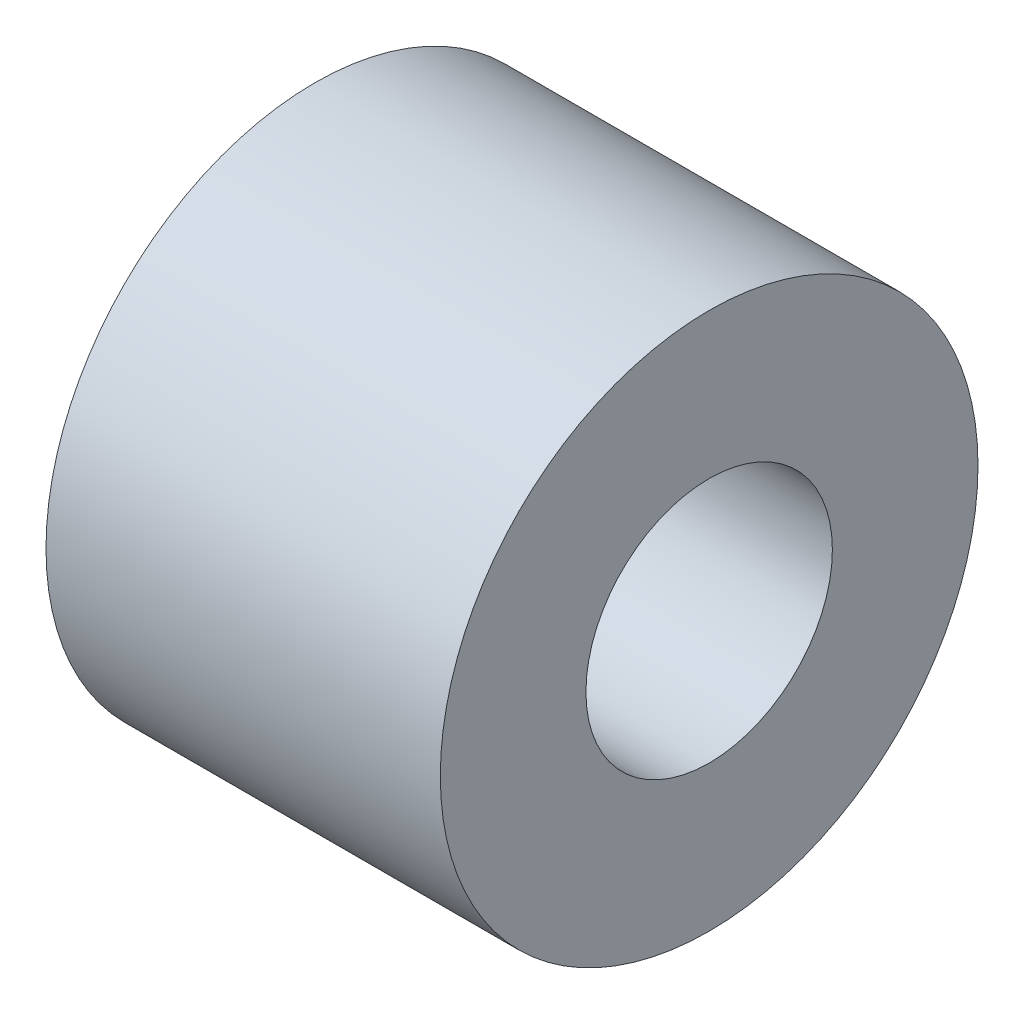
ISO-10303-21;
HEADER;
FILE_DESCRIPTION(('STEP AP214'),'2;1');
FILE_NAME('part.step','',(''),(''),'','','');
FILE_SCHEMA(('AUTOMOTIVE_DESIGN { 1 0 10303 214 1 1 1 1 }'));
ENDSEC;
DATA;
#1=APPLICATION_CONTEXT('core data for automotive mechanical design processes');
#2=APPLICATION_PROTOCOL_DEFINITION('international standard','automotive_design',2000,#1);
#3=PRODUCT_CONTEXT('',#1,'mechanical');
#4=PRODUCT('Part','Part','',(#3));
#5=PRODUCT_RELATED_PRODUCT_CATEGORY('part','',(#4));
#6=PRODUCT_DEFINITION_FORMATION('','',#4);
#7=PRODUCT_DEFINITION_CONTEXT('part definition',#1,'design');
#8=PRODUCT_DEFINITION('design','',#6,#7);
#9=PRODUCT_DEFINITION_SHAPE('','',#8);
#10=(LENGTH_UNIT() NAMED_UNIT(*) SI_UNIT(.MILLI.,.METRE.));
#11=(NAMED_UNIT(*) PLANE_ANGLE_UNIT() SI_UNIT($,.RADIAN.));
#12=(NAMED_UNIT(*) SI_UNIT($,.STERADIAN.) SOLID_ANGLE_UNIT());
#13=UNCERTAINTY_MEASURE_WITH_UNIT(LENGTH_MEASURE(1.E-05),#10,'distance_accuracy_value','');
#14=(GEOMETRIC_REPRESENTATION_CONTEXT(3) GLOBAL_UNCERTAINTY_ASSIGNED_CONTEXT((#13)) GLOBAL_UNIT_ASSIGNED_CONTEXT((#10,
#11,#12)) REPRESENTATION_CONTEXT('',''));
#15=CARTESIAN_POINT('',(0.,0.,0.));
#16=DIRECTION('',(0.,0.,1.));
#17=DIRECTION('',(1.,0.,0.));
#18=AXIS2_PLACEMENT_3D('',#15,#16,#17);
#19=CARTESIAN_POINT('',(4.4,0.,0.));
#20=DIRECTION('',(1.,0.,0.));
#21=DIRECTION('',(0.,0.,-1.));
#22=AXIS2_PLACEMENT_3D('',#19,#20,#21);
#23=PLANE('',#22);
#24=CARTESIAN_POINT('',(4.4,0.,0.));
#25=DIRECTION('',(1.,0.,0.));
#26=DIRECTION('',(0.,0.,-1.));
#27=AXIS2_PLACEMENT_3D('',#24,#25,#26);
#28=CIRCLE('',#27,2.75);
#29=CARTESIAN_POINT('',(4.4,0.,-2.75));
#30=VERTEX_POINT('',#29);
#31=EDGE_CURVE('E26',#30,#30,#28,.T.);
#32=ORIENTED_EDGE('',*,*,#31,.F.);
#33=EDGE_LOOP('',(#32));
#34=FACE_BOUND('',#33,.T.);
#35=CARTESIAN_POINT('',(4.4,0.,0.));
#36=DIRECTION('',(-1.,0.,0.));
#37=DIRECTION('',(0.,0.,1.));
#38=AXIS2_PLACEMENT_3D('',#35,#36,#37);
#39=CIRCLE('',#38,6.);
#40=CARTESIAN_POINT('',(4.4,0.,6.));
#41=VERTEX_POINT('',#40);
#42=EDGE_CURVE('E9',#41,#41,#39,.T.);
#43=ORIENTED_EDGE('',*,*,#42,.F.);
#44=EDGE_LOOP('',(#43));
#45=FACE_BOUND('',#44,.T.);
#46=ADVANCED_FACE('F14',(#34,#45),#23,.T.);
#47=CARTESIAN_POINT('',(-4.4,0.,0.));
#48=DIRECTION('',(-1.,0.,0.));
#49=DIRECTION('',(0.,0.,1.));
#50=AXIS2_PLACEMENT_3D('',#47,#48,#49);
#51=PLANE('',#50);
#52=CARTESIAN_POINT('',(-4.4,0.,0.));
#53=DIRECTION('',(-1.,0.,0.));
#54=DIRECTION('',(0.,0.,1.));
#55=AXIS2_PLACEMENT_3D('',#52,#53,#54);
#56=CIRCLE('',#55,2.75);
#57=CARTESIAN_POINT('',(-4.4,0.,2.75));
#58=VERTEX_POINT('',#57);
#59=EDGE_CURVE('E18',#58,#58,#56,.T.);
#60=ORIENTED_EDGE('',*,*,#59,.F.);
#61=EDGE_LOOP('',(#60));
#62=FACE_BOUND('',#61,.T.);
#63=CARTESIAN_POINT('',(-4.4,0.,0.));
#64=DIRECTION('',(1.,0.,0.));
#65=DIRECTION('',(0.,0.,-1.));
#66=AXIS2_PLACEMENT_3D('',#63,#64,#65);
#67=CIRCLE('',#66,6.);
#68=CARTESIAN_POINT('',(-4.4,0.,-6.));
#69=VERTEX_POINT('',#68);
#70=EDGE_CURVE('E22',#69,#69,#67,.T.);
#71=ORIENTED_EDGE('',*,*,#70,.F.);
#72=EDGE_LOOP('',(#71));
#73=FACE_BOUND('',#72,.T.);
#74=ADVANCED_FACE('F37',(#62,#73),#51,.T.);
#75=CARTESIAN_POINT('',(-4.4,0.,0.));
#76=DIRECTION('',(1.,0.,0.));
#77=DIRECTION('',(0.,0.,-1.));
#78=AXIS2_PLACEMENT_3D('',#75,#76,#77);
#79=CYLINDRICAL_SURFACE('',#78,6.);
#80=ORIENTED_EDGE('',*,*,#42,.T.);
#81=EDGE_LOOP('',(#80));
#82=FACE_BOUND('',#81,.T.);
#83=ORIENTED_EDGE('',*,*,#70,.T.);
#84=EDGE_LOOP('',(#83));
#85=FACE_BOUND('',#84,.T.);
#86=ADVANCED_FACE('F16',(#82,#85),#79,.T.);
#87=CARTESIAN_POINT('',(-4.7,0.,0.));
#88=DIRECTION('',(1.,0.,0.));
#89=DIRECTION('',(0.,0.,-1.));
#90=AXIS2_PLACEMENT_3D('',#87,#88,#89);
#91=CYLINDRICAL_SURFACE('',#90,2.75);
#92=ORIENTED_EDGE('',*,*,#31,.T.);
#93=EDGE_LOOP('',(#92));
#94=FACE_BOUND('',#93,.T.);
#95=ORIENTED_EDGE('',*,*,#59,.T.);
#96=EDGE_LOOP('',(#95));
#97=FACE_BOUND('',#96,.T.);
#98=ADVANCED_FACE('F35',(#94,#97),#91,.F.);
#99=CLOSED_SHELL('',(#46,#74,#86,#98));
#100=MANIFOLD_SOLID_BREP('B1',#99);
#101=ADVANCED_BREP_SHAPE_REPRESENTATION('',(#18,#100),#14);
#102=SHAPE_DEFINITION_REPRESENTATION(#9,#101);
ENDSEC;
END-ISO-10303-21;
